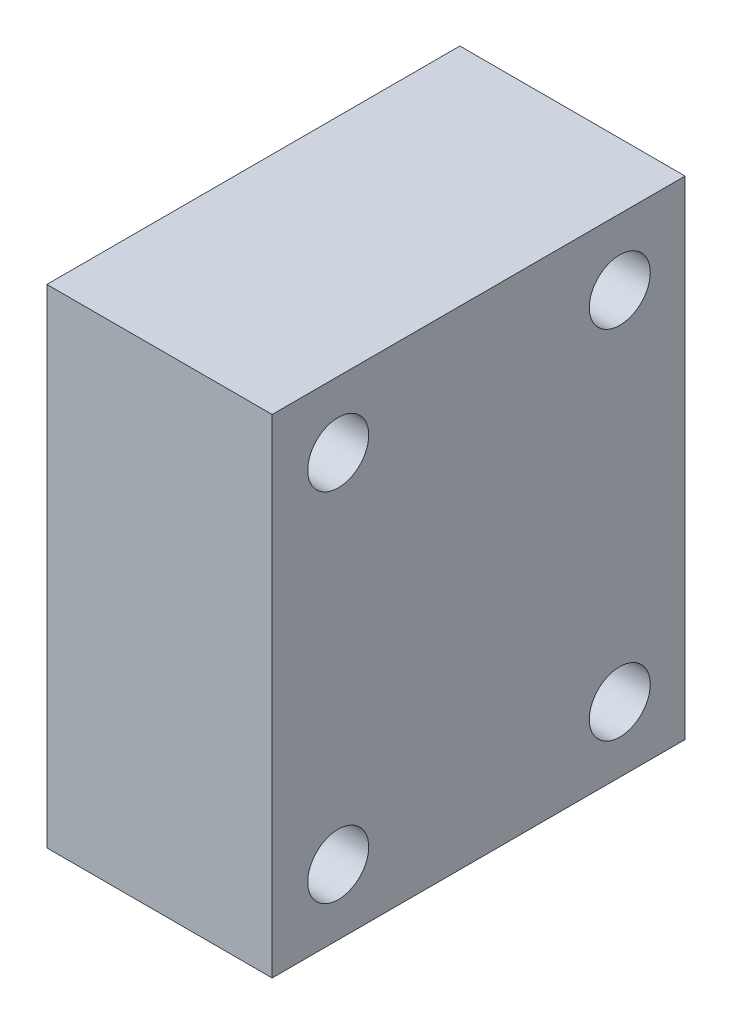
ISO-10303-21;
HEADER;
FILE_DESCRIPTION(('STEP AP214'),'2;1');
FILE_NAME('part.step','',(''),(''),'','','');
FILE_SCHEMA(('AUTOMOTIVE_DESIGN { 1 0 10303 214 1 1 1 1 }'));
ENDSEC;
DATA;
#1=APPLICATION_CONTEXT('core data for automotive mechanical design processes');
#2=APPLICATION_PROTOCOL_DEFINITION('international standard','automotive_design',2000,#1);
#3=PRODUCT_CONTEXT('',#1,'mechanical');
#4=PRODUCT('Part','Part','',(#3));
#5=PRODUCT_RELATED_PRODUCT_CATEGORY('part','',(#4));
#6=PRODUCT_DEFINITION_FORMATION('','',#4);
#7=PRODUCT_DEFINITION_CONTEXT('part definition',#1,'design');
#8=PRODUCT_DEFINITION('design','',#6,#7);
#9=PRODUCT_DEFINITION_SHAPE('','',#8);
#10=(LENGTH_UNIT() NAMED_UNIT(*) SI_UNIT(.MILLI.,.METRE.));
#11=(NAMED_UNIT(*) PLANE_ANGLE_UNIT() SI_UNIT($,.RADIAN.));
#12=(NAMED_UNIT(*) SI_UNIT($,.STERADIAN.) SOLID_ANGLE_UNIT());
#13=UNCERTAINTY_MEASURE_WITH_UNIT(LENGTH_MEASURE(1.E-05),#10,'distance_accuracy_value','');
#14=(GEOMETRIC_REPRESENTATION_CONTEXT(3) GLOBAL_UNCERTAINTY_ASSIGNED_CONTEXT((#13)) GLOBAL_UNIT_ASSIGNED_CONTEXT((#10,
#11,#12)) REPRESENTATION_CONTEXT('',''));
#15=CARTESIAN_POINT('',(0.,0.,0.));
#16=DIRECTION('',(0.,0.,1.));
#17=DIRECTION('',(1.,0.,0.));
#18=AXIS2_PLACEMENT_3D('',#15,#16,#17);
#19=CARTESIAN_POINT('',(38.1,0.,0.));
#20=DIRECTION('',(0.,1.,0.));
#21=DIRECTION('',(0.,0.,1.));
#22=AXIS2_PLACEMENT_3D('',#19,#20,#21);
#23=PLANE('',#22);
#24=DIRECTION('',(-1.,0.,0.));
#25=VECTOR('',#24,1.);
#26=CARTESIAN_POINT('',(2.8194,0.,28.5496));
#27=LINE('',#26,#25);
#28=CARTESIAN_POINT('',(0.,0.,28.5496));
#29=VERTEX_POINT('',#28);
#30=CARTESIAN_POINT('',(2.8194,0.,28.5496));
#31=VERTEX_POINT('',#30);
#32=EDGE_CURVE('E114',#29,#31,#27,.F.);
#33=ORIENTED_EDGE('',*,*,#32,.F.);
#34=DIRECTION('',(0.,0.,-1.));
#35=VECTOR('',#34,1.);
#36=CARTESIAN_POINT('',(0.,0.,0.));
#37=LINE('',#36,#35);
#38=CARTESIAN_POINT('',(0.,0.,0.));
#39=VERTEX_POINT('',#38);
#40=EDGE_CURVE('E177',#29,#39,#37,.T.);
#41=ORIENTED_EDGE('',*,*,#40,.T.);
#42=DIRECTION('',(-1.,0.,0.));
#43=VECTOR('',#42,1.);
#44=CARTESIAN_POINT('',(38.1,0.,0.));
#45=LINE('',#44,#43);
#46=CARTESIAN_POINT('',(38.1,0.,0.));
#47=VERTEX_POINT('',#46);
#48=EDGE_CURVE('E11',#47,#39,#45,.T.);
#49=ORIENTED_EDGE('',*,*,#48,.F.);
#50=DIRECTION('',(0.,0.,-1.));
#51=VECTOR('',#50,1.);
#52=CARTESIAN_POINT('',(38.1,0.,0.));
#53=LINE('',#52,#51);
#54=CARTESIAN_POINT('',(38.1,0.,69.85));
#55=VERTEX_POINT('',#54);
#56=EDGE_CURVE('E180',#55,#47,#53,.T.);
#57=ORIENTED_EDGE('',*,*,#56,.F.);
#58=DIRECTION('',(-1.,0.,0.));
#59=VECTOR('',#58,1.);
#60=CARTESIAN_POINT('',(38.1,0.,69.85));
#61=LINE('',#60,#59);
#62=CARTESIAN_POINT('',(0.,0.,69.85));
#63=VERTEX_POINT('',#62);
#64=EDGE_CURVE('E186',#55,#63,#61,.T.);
#65=ORIENTED_EDGE('',*,*,#64,.T.);
#66=CARTESIAN_POINT('',(0.,0.,54.0004));
#67=VERTEX_POINT('',#66);
#68=EDGE_CURVE('E187',#63,#67,#37,.T.);
#69=ORIENTED_EDGE('',*,*,#68,.T.);
#70=DIRECTION('',(-1.,0.,0.));
#71=VECTOR('',#70,1.);
#72=CARTESIAN_POINT('',(2.8194,0.,54.0004));
#73=LINE('',#72,#71);
#74=CARTESIAN_POINT('',(2.8194,0.,54.0004));
#75=VERTEX_POINT('',#74);
#76=EDGE_CURVE('E125',#75,#67,#73,.T.);
#77=ORIENTED_EDGE('',*,*,#76,.F.);
#78=DIRECTION('',(0.,0.,-1.));
#79=VECTOR('',#78,1.);
#80=CARTESIAN_POINT('',(2.8194,0.,0.));
#81=LINE('',#80,#79);
#82=EDGE_CURVE('E124',#75,#31,#81,.T.);
#83=ORIENTED_EDGE('',*,*,#82,.T.);
#84=EDGE_LOOP('',(#33,#41,#49,#57,#65,#69,#77,#83));
#85=FACE_BOUND('',#84,.T.);
#86=ADVANCED_FACE('F39',(#85),#23,.F.);
#87=CARTESIAN_POINT('',(2.8194,23.622,34.798));
#88=DIRECTION('',(-1.,0.,0.));
#89=DIRECTION('',(0.,0.,1.));
#90=AXIS2_PLACEMENT_3D('',#87,#88,#89);
#91=CYLINDRICAL_SURFACE('',#90,12.7254);
#92=CARTESIAN_POINT('',(2.8194,23.622,34.798));
#93=DIRECTION('',(1.,0.,0.));
#94=DIRECTION('',(0.,0.,-1.));
#95=AXIS2_PLACEMENT_3D('',#92,#93,#94);
#96=CIRCLE('',#95,12.7254);
#97=CARTESIAN_POINT('',(2.8194,10.8969551727166,34.7029247475546));
#98=VERTEX_POINT('',#97);
#99=CARTESIAN_POINT('',(2.8194,12.7250448272834,41.3700752524454));
#100=VERTEX_POINT('',#99);
#101=EDGE_CURVE('E130',#98,#100,#96,.T.);
#102=ORIENTED_EDGE('',*,*,#101,.T.);
#103=DIRECTION('',(-1.,0.,0.));
#104=VECTOR('',#103,1.);
#105=CARTESIAN_POINT('',(1.4097,12.7250448272834,41.3700752524454));
#106=LINE('',#105,#104);
#107=CARTESIAN_POINT('',(0.,12.7250448272834,41.3700752524454));
#108=VERTEX_POINT('',#107);
#109=EDGE_CURVE('E395',#100,#108,#106,.T.);
#110=ORIENTED_EDGE('',*,*,#109,.T.);
#111=CARTESIAN_POINT('',(0.,23.622,34.798));
#112=DIRECTION('',(1.,0.,0.));
#113=DIRECTION('',(0.,0.,-1.));
#114=AXIS2_PLACEMENT_3D('',#111,#112,#113);
#115=CIRCLE('',#114,12.7254);
#116=CARTESIAN_POINT('',(0.,10.8969551727166,34.7029247475546));
#117=VERTEX_POINT('',#116);
#118=EDGE_CURVE('E144',#117,#108,#115,.T.);
#119=ORIENTED_EDGE('',*,*,#118,.F.);
#120=DIRECTION('',(-1.,0.,0.));
#121=VECTOR('',#120,1.);
#122=CARTESIAN_POINT('',(1.4097,10.8969551727166,34.7029247475546));
#123=LINE('',#122,#121);
#124=EDGE_CURVE('E131',#117,#98,#123,.F.);
#125=ORIENTED_EDGE('',*,*,#124,.T.);
#126=EDGE_LOOP('',(#102,#110,#119,#125));
#127=FACE_BOUND('',#126,.T.);
#128=ADVANCED_FACE('F226',(#127),#91,.F.);
#129=CARTESIAN_POINT('',(38.1,0.,0.));
#130=DIRECTION('',(0.,0.,1.));
#131=DIRECTION('',(1.,0.,0.));
#132=AXIS2_PLACEMENT_3D('',#129,#130,#131);
#133=PLANE('',#132);
#134=DIRECTION('',(0.,1.,0.));
#135=VECTOR('',#134,1.);
#136=CARTESIAN_POINT('',(0.,0.,0.));
#137=LINE('',#136,#135);
#138=CARTESIAN_POINT('',(0.,82.55,0.));
#139=VERTEX_POINT('',#138);
#140=EDGE_CURVE('E189',#39,#139,#137,.T.);
#141=ORIENTED_EDGE('',*,*,#140,.T.);
#142=DIRECTION('',(-1.,0.,0.));
#143=VECTOR('',#142,1.);
#144=CARTESIAN_POINT('',(38.1,82.55,0.));
#145=LINE('',#144,#143);
#146=CARTESIAN_POINT('',(38.1,82.55,0.));
#147=VERTEX_POINT('',#146);
#148=EDGE_CURVE('E47',#147,#139,#145,.T.);
#149=ORIENTED_EDGE('',*,*,#148,.F.);
#150=DIRECTION('',(0.,1.,0.));
#151=VECTOR('',#150,1.);
#152=CARTESIAN_POINT('',(38.1,0.,0.));
#153=LINE('',#152,#151);
#154=EDGE_CURVE('E92',#47,#147,#153,.T.);
#155=ORIENTED_EDGE('',*,*,#154,.F.);
#156=ORIENTED_EDGE('',*,*,#48,.T.);
#157=EDGE_LOOP('',(#141,#149,#155,#156));
#158=FACE_BOUND('',#157,.T.);
#159=ADVANCED_FACE('F230',(#158),#133,.F.);
#160=CARTESIAN_POINT('',(38.1,82.55,0.));
#161=DIRECTION('',(0.,-1.,0.));
#162=DIRECTION('',(0.,0.,-1.));
#163=AXIS2_PLACEMENT_3D('',#160,#161,#162);
#164=PLANE('',#163);
#165=DIRECTION('',(0.,0.,1.));
#166=VECTOR('',#165,1.);
#167=CARTESIAN_POINT('',(0.,82.55,0.));
#168=LINE('',#167,#166);
#169=CARTESIAN_POINT('',(0.,82.55,69.85));
#170=VERTEX_POINT('',#169);
#171=EDGE_CURVE('E191',#139,#170,#168,.T.);
#172=ORIENTED_EDGE('',*,*,#171,.T.);
#173=DIRECTION('',(-1.,0.,0.));
#174=VECTOR('',#173,1.);
#175=CARTESIAN_POINT('',(38.1,82.55,69.85));
#176=LINE('',#175,#174);
#177=CARTESIAN_POINT('',(38.1,82.55,69.85));
#178=VERTEX_POINT('',#177);
#179=EDGE_CURVE('E195',#178,#170,#176,.T.);
#180=ORIENTED_EDGE('',*,*,#179,.F.);
#181=DIRECTION('',(0.,0.,1.));
#182=VECTOR('',#181,1.);
#183=CARTESIAN_POINT('',(38.1,82.55,0.));
#184=LINE('',#183,#182);
#185=EDGE_CURVE('E183',#147,#178,#184,.T.);
#186=ORIENTED_EDGE('',*,*,#185,.F.);
#187=ORIENTED_EDGE('',*,*,#148,.T.);
#188=EDGE_LOOP('',(#172,#180,#186,#187));
#189=FACE_BOUND('',#188,.T.);
#190=ADVANCED_FACE('F237',(#189),#164,.F.);
#191=CARTESIAN_POINT('',(38.1,0.,69.85));
#192=DIRECTION('',(0.,0.,-1.));
#193=DIRECTION('',(-1.,0.,0.));
#194=AXIS2_PLACEMENT_3D('',#191,#192,#193);
#195=PLANE('',#194);
#196=DIRECTION('',(0.,-1.,0.));
#197=VECTOR('',#196,1.);
#198=CARTESIAN_POINT('',(0.,0.,69.85));
#199=LINE('',#198,#197);
#200=EDGE_CURVE('E85',#170,#63,#199,.T.);
#201=ORIENTED_EDGE('',*,*,#200,.T.);
#202=ORIENTED_EDGE('',*,*,#64,.F.);
#203=DIRECTION('',(0.,-1.,0.));
#204=VECTOR('',#203,1.);
#205=CARTESIAN_POINT('',(38.1,0.,69.85));
#206=LINE('',#205,#204);
#207=EDGE_CURVE('E64',#178,#55,#206,.T.);
#208=ORIENTED_EDGE('',*,*,#207,.F.);
#209=ORIENTED_EDGE('',*,*,#179,.T.);
#210=EDGE_LOOP('',(#201,#202,#208,#209));
#211=FACE_BOUND('',#210,.T.);
#212=ADVANCED_FACE('F373',(#211),#195,.F.);
#213=CARTESIAN_POINT('',(38.1,0.,0.));
#214=DIRECTION('',(-1.,0.,0.));
#215=DIRECTION('',(0.,0.,1.));
#216=AXIS2_PLACEMENT_3D('',#213,#214,#215);
#217=PLANE('',#216);
#218=CARTESIAN_POINT('',(38.1,71.374,11.049));
#219=DIRECTION('',(1.,0.,0.));
#220=DIRECTION('',(0.,0.,-1.));
#221=AXIS2_PLACEMENT_3D('',#218,#219,#220);
#222=CIRCLE('',#221,5.15937499999999);
#223=CARTESIAN_POINT('',(38.1,71.374,5.88962500000001));
#224=VERTEX_POINT('',#223);
#225=EDGE_CURVE('E166',#224,#224,#222,.T.);
#226=ORIENTED_EDGE('',*,*,#225,.F.);
#227=EDGE_LOOP('',(#226));
#228=FACE_BOUND('',#227,.T.);
#229=CARTESIAN_POINT('',(38.1,11.049,58.674));
#230=DIRECTION('',(1.,0.,0.));
#231=DIRECTION('',(0.,0.,-1.));
#232=AXIS2_PLACEMENT_3D('',#229,#230,#231);
#233=CIRCLE('',#232,5.159375);
#234=CARTESIAN_POINT('',(38.1,11.049,53.514625));
#235=VERTEX_POINT('',#234);
#236=EDGE_CURVE('E159',#235,#235,#233,.T.);
#237=ORIENTED_EDGE('',*,*,#236,.F.);
#238=EDGE_LOOP('',(#237));
#239=FACE_BOUND('',#238,.T.);
#240=CARTESIAN_POINT('',(38.1,71.374,58.674));
#241=DIRECTION('',(1.,0.,0.));
#242=DIRECTION('',(0.,0.,-1.));
#243=AXIS2_PLACEMENT_3D('',#240,#241,#242);
#244=CIRCLE('',#243,5.15937499999999);
#245=CARTESIAN_POINT('',(38.1,71.374,53.514625));
#246=VERTEX_POINT('',#245);
#247=EDGE_CURVE('E152',#246,#246,#244,.T.);
#248=ORIENTED_EDGE('',*,*,#247,.F.);
#249=EDGE_LOOP('',(#248));
#250=FACE_BOUND('',#249,.T.);
#251=CARTESIAN_POINT('',(38.1,11.049,11.049));
#252=DIRECTION('',(1.,0.,0.));
#253=DIRECTION('',(0.,0.,-1.));
#254=AXIS2_PLACEMENT_3D('',#251,#252,#253);
#255=CIRCLE('',#254,5.159375);
#256=CARTESIAN_POINT('',(38.1,11.049,5.889625));
#257=VERTEX_POINT('',#256);
#258=EDGE_CURVE('E174',#257,#257,#255,.T.);
#259=ORIENTED_EDGE('',*,*,#258,.F.);
#260=EDGE_LOOP('',(#259));
#261=FACE_BOUND('',#260,.T.);
#262=ORIENTED_EDGE('',*,*,#56,.T.);
#263=ORIENTED_EDGE('',*,*,#154,.T.);
#264=ORIENTED_EDGE('',*,*,#185,.T.);
#265=ORIENTED_EDGE('',*,*,#207,.T.);
#266=EDGE_LOOP('',(#262,#263,#264,#265));
#267=FACE_BOUND('',#266,.T.);
#268=ADVANCED_FACE('F328',(#228,#239,#250,#261,#267),#217,.F.);
#269=CARTESIAN_POINT('',(0.,0.,0.));
#270=DIRECTION('',(-1.,0.,0.));
#271=DIRECTION('',(0.,0.,1.));
#272=AXIS2_PLACEMENT_3D('',#269,#270,#271);
#273=PLANE('',#272);
#274=ORIENTED_EDGE('',*,*,#40,.F.);
#275=CARTESIAN_POINT('',(0.,0.,41.275));
#276=DIRECTION('',(1.,0.,0.));
#277=DIRECTION('',(0.,0.,-1.));
#278=AXIS2_PLACEMENT_3D('',#275,#276,#277);
#279=CIRCLE('',#278,12.7254);
#280=EDGE_CURVE('E120',#29,#117,#279,.T.);
#281=ORIENTED_EDGE('',*,*,#280,.T.);
#282=ORIENTED_EDGE('',*,*,#118,.T.);
#283=EDGE_CURVE('E389',#108,#67,#279,.T.);
#284=ORIENTED_EDGE('',*,*,#283,.T.);
#285=ORIENTED_EDGE('',*,*,#68,.F.);
#286=ORIENTED_EDGE('',*,*,#200,.F.);
#287=ORIENTED_EDGE('',*,*,#171,.F.);
#288=ORIENTED_EDGE('',*,*,#140,.F.);
#289=EDGE_LOOP('',(#274,#281,#282,#284,#285,#286,#287,#288));
#290=FACE_BOUND('',#289,.T.);
#291=CARTESIAN_POINT('',(0.,58.674,34.798));
#292=DIRECTION('',(1.,0.,0.));
#293=DIRECTION('',(0.,0.,-1.));
#294=AXIS2_PLACEMENT_3D('',#291,#292,#293);
#295=CIRCLE('',#294,12.7254);
#296=CARTESIAN_POINT('',(0.,58.674,22.0726));
#297=VERTEX_POINT('',#296);
#298=EDGE_CURVE('E138',#297,#297,#295,.T.);
#299=ORIENTED_EDGE('',*,*,#298,.T.);
#300=EDGE_LOOP('',(#299));
#301=FACE_BOUND('',#300,.T.);
#302=CARTESIAN_POINT('',(0.,71.374,11.049));
#303=DIRECTION('',(1.,0.,0.));
#304=DIRECTION('',(0.,0.,-1.));
#305=AXIS2_PLACEMENT_3D('',#302,#303,#304);
#306=CIRCLE('',#305,5.15937499999999);
#307=CARTESIAN_POINT('',(0.,71.374,5.88962500000001));
#308=VERTEX_POINT('',#307);
#309=EDGE_CURVE('E162',#308,#308,#306,.T.);
#310=ORIENTED_EDGE('',*,*,#309,.T.);
#311=EDGE_LOOP('',(#310));
#312=FACE_BOUND('',#311,.T.);
#313=CARTESIAN_POINT('',(0.,11.049,58.674));
#314=DIRECTION('',(1.,0.,0.));
#315=DIRECTION('',(0.,0.,-1.));
#316=AXIS2_PLACEMENT_3D('',#313,#314,#315);
#317=CIRCLE('',#316,5.159375);
#318=CARTESIAN_POINT('',(0.,11.049,53.514625));
#319=VERTEX_POINT('',#318);
#320=EDGE_CURVE('E169',#319,#319,#317,.T.);
#321=ORIENTED_EDGE('',*,*,#320,.T.);
#322=EDGE_LOOP('',(#321));
#323=FACE_BOUND('',#322,.T.);
#324=CARTESIAN_POINT('',(0.,71.374,58.674));
#325=DIRECTION('',(1.,0.,0.));
#326=DIRECTION('',(0.,0.,-1.));
#327=AXIS2_PLACEMENT_3D('',#324,#325,#326);
#328=CIRCLE('',#327,5.15937499999999);
#329=CARTESIAN_POINT('',(0.,71.374,53.514625));
#330=VERTEX_POINT('',#329);
#331=EDGE_CURVE('E156',#330,#330,#328,.T.);
#332=ORIENTED_EDGE('',*,*,#331,.T.);
#333=EDGE_LOOP('',(#332));
#334=FACE_BOUND('',#333,.T.);
#335=CARTESIAN_POINT('',(0.,11.049,11.049));
#336=DIRECTION('',(1.,0.,0.));
#337=DIRECTION('',(0.,0.,-1.));
#338=AXIS2_PLACEMENT_3D('',#335,#336,#337);
#339=CIRCLE('',#338,5.159375);
#340=CARTESIAN_POINT('',(0.,11.049,5.889625));
#341=VERTEX_POINT('',#340);
#342=EDGE_CURVE('E165',#341,#341,#339,.T.);
#343=ORIENTED_EDGE('',*,*,#342,.T.);
#344=EDGE_LOOP('',(#343));
#345=FACE_BOUND('',#344,.T.);
#346=ADVANCED_FACE('F324',(#290,#301,#312,#323,#334,#345),#273,.T.);
#347=CARTESIAN_POINT('',(38.1,11.049,11.049));
#348=DIRECTION('',(-1.,0.,0.));
#349=DIRECTION('',(0.,0.,1.));
#350=AXIS2_PLACEMENT_3D('',#347,#348,#349);
#351=CYLINDRICAL_SURFACE('',#350,5.159375);
#352=ORIENTED_EDGE('',*,*,#258,.T.);
#353=EDGE_LOOP('',(#352));
#354=FACE_BOUND('',#353,.T.);
#355=ORIENTED_EDGE('',*,*,#342,.F.);
#356=EDGE_LOOP('',(#355));
#357=FACE_BOUND('',#356,.T.);
#358=ADVANCED_FACE('F327',(#354,#357),#351,.F.);
#359=CARTESIAN_POINT('',(38.1,71.374,58.674));
#360=DIRECTION('',(-1.,0.,0.));
#361=DIRECTION('',(0.,0.,1.));
#362=AXIS2_PLACEMENT_3D('',#359,#360,#361);
#363=CYLINDRICAL_SURFACE('',#362,5.15937499999999);
#364=ORIENTED_EDGE('',*,*,#247,.T.);
#365=EDGE_LOOP('',(#364));
#366=FACE_BOUND('',#365,.T.);
#367=ORIENTED_EDGE('',*,*,#331,.F.);
#368=EDGE_LOOP('',(#367));
#369=FACE_BOUND('',#368,.T.);
#370=ADVANCED_FACE('F347',(#366,#369),#363,.F.);
#371=CARTESIAN_POINT('',(38.1,11.049,58.674));
#372=DIRECTION('',(-1.,0.,0.));
#373=DIRECTION('',(0.,0.,1.));
#374=AXIS2_PLACEMENT_3D('',#371,#372,#373);
#375=CYLINDRICAL_SURFACE('',#374,5.159375);
#376=ORIENTED_EDGE('',*,*,#236,.T.);
#377=EDGE_LOOP('',(#376));
#378=FACE_BOUND('',#377,.T.);
#379=ORIENTED_EDGE('',*,*,#320,.F.);
#380=EDGE_LOOP('',(#379));
#381=FACE_BOUND('',#380,.T.);
#382=ADVANCED_FACE('F356',(#378,#381),#375,.F.);
#383=CARTESIAN_POINT('',(38.1,71.374,11.049));
#384=DIRECTION('',(-1.,0.,0.));
#385=DIRECTION('',(0.,0.,1.));
#386=AXIS2_PLACEMENT_3D('',#383,#384,#385);
#387=CYLINDRICAL_SURFACE('',#386,5.15937499999999);
#388=ORIENTED_EDGE('',*,*,#225,.T.);
#389=EDGE_LOOP('',(#388));
#390=FACE_BOUND('',#389,.T.);
#391=ORIENTED_EDGE('',*,*,#309,.F.);
#392=EDGE_LOOP('',(#391));
#393=FACE_BOUND('',#392,.T.);
#394=ADVANCED_FACE('F281',(#390,#393),#387,.F.);
#395=CARTESIAN_POINT('',(2.8194,23.622,34.798));
#396=DIRECTION('',(1.,0.,0.));
#397=DIRECTION('',(0.,0.,-1.));
#398=AXIS2_PLACEMENT_3D('',#395,#396,#397);
#399=PLANE('',#398);
#400=ORIENTED_EDGE('',*,*,#101,.F.);
#401=CARTESIAN_POINT('',(2.8194,0.,41.275));
#402=DIRECTION('',(1.,0.,0.));
#403=DIRECTION('',(0.,0.,-1.));
#404=AXIS2_PLACEMENT_3D('',#401,#402,#403);
#405=CIRCLE('',#404,12.7254);
#406=EDGE_CURVE('E117',#31,#98,#405,.T.);
#407=ORIENTED_EDGE('',*,*,#406,.F.);
#408=ORIENTED_EDGE('',*,*,#82,.F.);
#409=EDGE_CURVE('E55',#100,#75,#405,.T.);
#410=ORIENTED_EDGE('',*,*,#409,.F.);
#411=EDGE_LOOP('',(#400,#407,#408,#410));
#412=FACE_BOUND('',#411,.T.);
#413=CARTESIAN_POINT('',(2.8194,23.622,34.798));
#414=DIRECTION('',(1.,0.,0.));
#415=DIRECTION('',(0.,0.,-1.));
#416=AXIS2_PLACEMENT_3D('',#413,#414,#415);
#417=CIRCLE('',#416,7.3421875);
#418=CARTESIAN_POINT('',(2.8194,23.622,27.4558125));
#419=VERTEX_POINT('',#418);
#420=EDGE_CURVE('E143',#419,#419,#417,.T.);
#421=ORIENTED_EDGE('',*,*,#420,.T.);
#422=EDGE_LOOP('',(#421));
#423=FACE_BOUND('',#422,.T.);
#424=ADVANCED_FACE('F127',(#412,#423),#399,.F.);
#425=CARTESIAN_POINT('',(2.8194,58.674,34.798));
#426=DIRECTION('',(-1.,0.,0.));
#427=DIRECTION('',(0.,0.,1.));
#428=AXIS2_PLACEMENT_3D('',#425,#426,#427);
#429=CYLINDRICAL_SURFACE('',#428,12.7254);
#430=CARTESIAN_POINT('',(2.8194,58.674,34.798));
#431=DIRECTION('',(1.,0.,0.));
#432=DIRECTION('',(0.,0.,-1.));
#433=AXIS2_PLACEMENT_3D('',#430,#431,#432);
#434=CIRCLE('',#433,12.7254);
#435=CARTESIAN_POINT('',(2.8194,58.674,22.0726));
#436=VERTEX_POINT('',#435);
#437=EDGE_CURVE('E135',#436,#436,#434,.T.);
#438=ORIENTED_EDGE('',*,*,#437,.T.);
#439=EDGE_LOOP('',(#438));
#440=FACE_BOUND('',#439,.T.);
#441=ORIENTED_EDGE('',*,*,#298,.F.);
#442=EDGE_LOOP('',(#441));
#443=FACE_BOUND('',#442,.T.);
#444=ADVANCED_FACE('F241',(#440,#443),#429,.F.);
#445=CARTESIAN_POINT('',(2.8194,58.674,34.798));
#446=DIRECTION('',(1.,0.,0.));
#447=DIRECTION('',(0.,0.,-1.));
#448=AXIS2_PLACEMENT_3D('',#445,#446,#447);
#449=PLANE('',#448);
#450=CARTESIAN_POINT('',(2.8194,58.674,34.798));
#451=DIRECTION('',(1.,0.,0.));
#452=DIRECTION('',(0.,0.,-1.));
#453=AXIS2_PLACEMENT_3D('',#450,#451,#452);
#454=CIRCLE('',#453,7.3421875);
#455=CARTESIAN_POINT('',(2.8194,58.674,27.4558125));
#456=VERTEX_POINT('',#455);
#457=EDGE_CURVE('E42',#456,#456,#454,.T.);
#458=ORIENTED_EDGE('',*,*,#457,.T.);
#459=EDGE_LOOP('',(#458));
#460=FACE_BOUND('',#459,.T.);
#461=ORIENTED_EDGE('',*,*,#437,.F.);
#462=EDGE_LOOP('',(#461));
#463=FACE_BOUND('',#462,.T.);
#464=ADVANCED_FACE('F203',(#460,#463),#449,.F.);
#465=CARTESIAN_POINT('',(28.448,23.622,34.798));
#466=DIRECTION('',(1.,0.,0.));
#467=DIRECTION('',(0.,0.,-1.));
#468=AXIS2_PLACEMENT_3D('',#465,#466,#467);
#469=PLANE('',#468);
#470=CARTESIAN_POINT('',(28.448,23.622,34.798));
#471=DIRECTION('',(1.,0.,0.));
#472=DIRECTION('',(0.,0.,-1.));
#473=AXIS2_PLACEMENT_3D('',#470,#471,#472);
#474=CIRCLE('',#473,7.3421875);
#475=CARTESIAN_POINT('',(28.448,23.622,27.4558125));
#476=VERTEX_POINT('',#475);
#477=EDGE_CURVE('E149',#476,#476,#474,.T.);
#478=ORIENTED_EDGE('',*,*,#477,.F.);
#479=EDGE_LOOP('',(#478));
#480=FACE_BOUND('',#479,.T.);
#481=ADVANCED_FACE('F221',(#480),#469,.F.);
#482=CARTESIAN_POINT('',(28.448,23.622,34.798));
#483=DIRECTION('',(-1.,0.,0.));
#484=DIRECTION('',(0.,0.,1.));
#485=AXIS2_PLACEMENT_3D('',#482,#483,#484);
#486=CYLINDRICAL_SURFACE('',#485,7.3421875);
#487=ORIENTED_EDGE('',*,*,#420,.F.);
#488=EDGE_LOOP('',(#487));
#489=FACE_BOUND('',#488,.T.);
#490=ORIENTED_EDGE('',*,*,#477,.T.);
#491=EDGE_LOOP('',(#490));
#492=FACE_BOUND('',#491,.T.);
#493=ADVANCED_FACE('F214',(#489,#492),#486,.F.);
#494=CARTESIAN_POINT('',(28.448,58.674,34.798));
#495=DIRECTION('',(1.,0.,0.));
#496=DIRECTION('',(0.,0.,-1.));
#497=AXIS2_PLACEMENT_3D('',#494,#495,#496);
#498=PLANE('',#497);
#499=CARTESIAN_POINT('',(28.448,58.674,34.798));
#500=DIRECTION('',(1.,0.,0.));
#501=DIRECTION('',(0.,0.,-1.));
#502=AXIS2_PLACEMENT_3D('',#499,#500,#501);
#503=CIRCLE('',#502,7.3421875);
#504=CARTESIAN_POINT('',(28.448,58.674,27.4558125));
#505=VERTEX_POINT('',#504);
#506=EDGE_CURVE('E153',#505,#505,#503,.T.);
#507=ORIENTED_EDGE('',*,*,#506,.F.);
#508=EDGE_LOOP('',(#507));
#509=FACE_BOUND('',#508,.T.);
#510=ADVANCED_FACE('F209',(#509),#498,.F.);
#511=CARTESIAN_POINT('',(28.448,58.674,34.798));
#512=DIRECTION('',(-1.,0.,0.));
#513=DIRECTION('',(0.,0.,1.));
#514=AXIS2_PLACEMENT_3D('',#511,#512,#513);
#515=CYLINDRICAL_SURFACE('',#514,7.3421875);
#516=ORIENTED_EDGE('',*,*,#457,.F.);
#517=EDGE_LOOP('',(#516));
#518=FACE_BOUND('',#517,.T.);
#519=ORIENTED_EDGE('',*,*,#506,.T.);
#520=EDGE_LOOP('',(#519));
#521=FACE_BOUND('',#520,.T.);
#522=ADVANCED_FACE('F206',(#518,#521),#515,.F.);
#523=CARTESIAN_POINT('',(2.8194,0.,41.275));
#524=DIRECTION('',(-1.,0.,0.));
#525=DIRECTION('',(0.,0.,1.));
#526=AXIS2_PLACEMENT_3D('',#523,#524,#525);
#527=CYLINDRICAL_SURFACE('',#526,12.7254);
#528=ORIENTED_EDGE('',*,*,#32,.T.);
#529=ORIENTED_EDGE('',*,*,#406,.T.);
#530=ORIENTED_EDGE('',*,*,#124,.F.);
#531=ORIENTED_EDGE('',*,*,#280,.F.);
#532=EDGE_LOOP('',(#528,#529,#530,#531));
#533=FACE_BOUND('',#532,.T.);
#534=ADVANCED_FACE('F116',(#533),#527,.F.);
#535=ORIENTED_EDGE('',*,*,#76,.T.);
#536=ORIENTED_EDGE('',*,*,#283,.F.);
#537=ORIENTED_EDGE('',*,*,#109,.F.);
#538=ORIENTED_EDGE('',*,*,#409,.T.);
#539=EDGE_LOOP('',(#535,#536,#537,#538));
#540=FACE_BOUND('',#539,.T.);
#541=ADVANCED_FACE('F310',(#540),#527,.F.);
#542=CLOSED_SHELL('',(#86,#128,#159,#190,#212,#268,#346,#358,#370,#382,#394,#424,#444,#464,#481,
#493,#510,#522,#534,#541));
#543=MANIFOLD_SOLID_BREP('B2',#542);
#544=ADVANCED_BREP_SHAPE_REPRESENTATION('',(#18,#543),#14);
#545=SHAPE_DEFINITION_REPRESENTATION(#9,#544);
ENDSEC;
END-ISO-10303-21;
